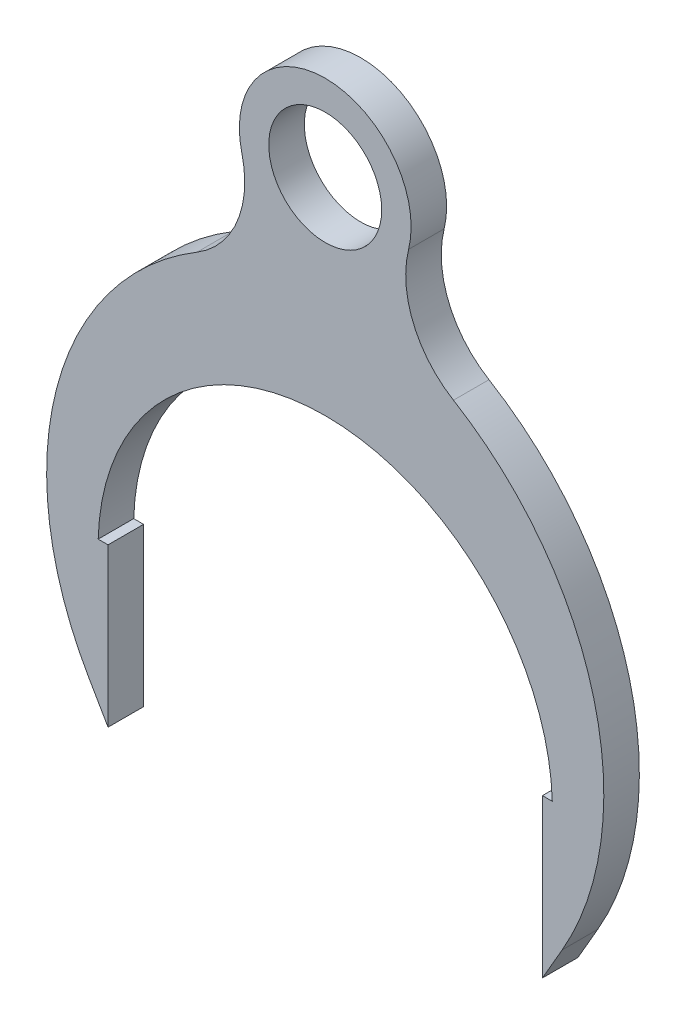
ISO-10303-21;
HEADER;
FILE_DESCRIPTION(('STEP AP214'),'2;1');
FILE_NAME('part.step','',(''),(''),'','','');
FILE_SCHEMA(('AUTOMOTIVE_DESIGN { 1 0 10303 214 1 1 1 1 }'));
ENDSEC;
DATA;
#1=APPLICATION_CONTEXT('core data for automotive mechanical design processes');
#2=APPLICATION_PROTOCOL_DEFINITION('international standard','automotive_design',2000,#1);
#3=PRODUCT_CONTEXT('',#1,'mechanical');
#4=PRODUCT('Part','Part','',(#3));
#5=PRODUCT_RELATED_PRODUCT_CATEGORY('part','',(#4));
#6=PRODUCT_DEFINITION_FORMATION('','',#4);
#7=PRODUCT_DEFINITION_CONTEXT('part definition',#1,'design');
#8=PRODUCT_DEFINITION('design','',#6,#7);
#9=PRODUCT_DEFINITION_SHAPE('','',#8);
#10=(LENGTH_UNIT() NAMED_UNIT(*) SI_UNIT(.MILLI.,.METRE.));
#11=(NAMED_UNIT(*) PLANE_ANGLE_UNIT() SI_UNIT($,.RADIAN.));
#12=(NAMED_UNIT(*) SI_UNIT($,.STERADIAN.) SOLID_ANGLE_UNIT());
#13=UNCERTAINTY_MEASURE_WITH_UNIT(LENGTH_MEASURE(1.E-05),#10,'distance_accuracy_value','');
#14=(GEOMETRIC_REPRESENTATION_CONTEXT(3) GLOBAL_UNCERTAINTY_ASSIGNED_CONTEXT((#13)) GLOBAL_UNIT_ASSIGNED_CONTEXT((#10,
#11,#12)) REPRESENTATION_CONTEXT('',''));
#15=CARTESIAN_POINT('',(0.,0.,0.));
#16=DIRECTION('',(0.,0.,1.));
#17=DIRECTION('',(1.,0.,0.));
#18=AXIS2_PLACEMENT_3D('',#15,#16,#17);
#19=CARTESIAN_POINT('',(-55.0000000000003,-148.087398310348,9.));
#20=DIRECTION('',(-0.866025403784441,-0.499999999999996,0.));
#21=DIRECTION('',(0.499999999999996,-0.866025403784441,0.));
#22=AXIS2_PLACEMENT_3D('',#19,#20,#21);
#23=PLANE('',#22);
#24=DIRECTION('',(0.,0.,1.));
#25=VECTOR('',#24,1.);
#26=CARTESIAN_POINT('',(-60.0000000000003,-139.427144272504,9.));
#27=LINE('',#26,#25);
#28=CARTESIAN_POINT('',(-60.0000000000003,-139.427144272504,0.));
#29=VERTEX_POINT('',#28);
#30=CARTESIAN_POINT('',(-60.0000000000003,-139.427144272504,9.));
#31=VERTEX_POINT('',#30);
#32=EDGE_CURVE('E11',#29,#31,#27,.T.);
#33=ORIENTED_EDGE('',*,*,#32,.F.);
#34=DIRECTION('',(0.499999999999996,-0.866025403784441,0.));
#35=VECTOR('',#34,1.);
#36=CARTESIAN_POINT('',(-55.0000000000003,-148.087398310348,0.));
#37=LINE('',#36,#35);
#38=CARTESIAN_POINT('',(-55.0000000000003,-148.087398310348,0.));
#39=VERTEX_POINT('',#38);
#40=EDGE_CURVE('E120',#29,#39,#37,.T.);
#41=ORIENTED_EDGE('',*,*,#40,.T.);
#42=DIRECTION('',(0.,0.,1.));
#43=VECTOR('',#42,1.);
#44=CARTESIAN_POINT('',(-55.0000000000003,-148.087398310348,9.));
#45=LINE('',#44,#43);
#46=CARTESIAN_POINT('',(-55.0000000000003,-148.087398310348,9.));
#47=VERTEX_POINT('',#46);
#48=EDGE_CURVE('E49',#39,#47,#45,.T.);
#49=ORIENTED_EDGE('',*,*,#48,.T.);
#50=DIRECTION('',(0.499999999999996,-0.866025403784441,0.));
#51=VECTOR('',#50,1.);
#52=CARTESIAN_POINT('',(-55.0000000000003,-148.087398310348,9.));
#53=LINE('',#52,#51);
#54=EDGE_CURVE('E186',#31,#47,#53,.T.);
#55=ORIENTED_EDGE('',*,*,#54,.F.);
#56=EDGE_LOOP('',(#33,#41,#49,#55));
#57=FACE_BOUND('',#56,.T.);
#58=ADVANCED_FACE('F39',(#57),#23,.T.);
#59=CARTESIAN_POINT('',(-55.0000000000003,-108.087398310348,9.));
#60=DIRECTION('',(1.,0.,0.));
#61=DIRECTION('',(0.,1.,0.));
#62=AXIS2_PLACEMENT_3D('',#59,#60,#61);
#63=PLANE('',#62);
#64=ORIENTED_EDGE('',*,*,#48,.F.);
#65=DIRECTION('',(0.,1.,0.));
#66=VECTOR('',#65,1.);
#67=CARTESIAN_POINT('',(-55.0000000000003,-11.2253442370643,0.));
#68=LINE('',#67,#66);
#69=CARTESIAN_POINT('',(-55.0000000000003,-108.087398310348,0.));
#70=VERTEX_POINT('',#69);
#71=EDGE_CURVE('E151',#39,#70,#68,.T.);
#72=ORIENTED_EDGE('',*,*,#71,.T.);
#73=DIRECTION('',(0.,0.,1.));
#74=VECTOR('',#73,1.);
#75=CARTESIAN_POINT('',(-55.0000000000003,-108.087398310348,9.));
#76=LINE('',#75,#74);
#77=CARTESIAN_POINT('',(-55.0000000000003,-108.087398310348,9.));
#78=VERTEX_POINT('',#77);
#79=EDGE_CURVE('E179',#70,#78,#76,.T.);
#80=ORIENTED_EDGE('',*,*,#79,.T.);
#81=DIRECTION('',(0.,1.,0.));
#82=VECTOR('',#81,1.);
#83=CARTESIAN_POINT('',(-55.0000000000003,-108.087398310348,9.));
#84=LINE('',#83,#82);
#85=EDGE_CURVE('E196',#47,#78,#84,.T.);
#86=ORIENTED_EDGE('',*,*,#85,.F.);
#87=EDGE_LOOP('',(#64,#72,#80,#86));
#88=FACE_BOUND('',#87,.T.);
#89=ADVANCED_FACE('F199',(#88),#63,.T.);
#90=CARTESIAN_POINT('',(-57.5000000000003,-108.087398310348,9.));
#91=DIRECTION('',(0.,1.,0.));
#92=DIRECTION('',(-1.,0.,0.));
#93=AXIS2_PLACEMENT_3D('',#90,#91,#92);
#94=PLANE('',#93);
#95=ORIENTED_EDGE('',*,*,#79,.F.);
#96=DIRECTION('',(1.,0.,0.));
#97=VECTOR('',#96,1.);
#98=CARTESIAN_POINT('',(-45.382310945559,-108.087398310348,0.));
#99=LINE('',#98,#97);
#100=CARTESIAN_POINT('',(-57.5000000000003,-108.087398310348,0.));
#101=VERTEX_POINT('',#100);
#102=EDGE_CURVE('E148',#70,#101,#99,.F.);
#103=ORIENTED_EDGE('',*,*,#102,.T.);
#104=DIRECTION('',(0.,0.,1.));
#105=VECTOR('',#104,1.);
#106=CARTESIAN_POINT('',(-57.5000000000003,-108.087398310348,9.));
#107=LINE('',#106,#105);
#108=CARTESIAN_POINT('',(-57.5000000000003,-108.087398310348,9.));
#109=VERTEX_POINT('',#108);
#110=EDGE_CURVE('E176',#101,#109,#107,.T.);
#111=ORIENTED_EDGE('',*,*,#110,.T.);
#112=DIRECTION('',(-1.,0.,0.));
#113=VECTOR('',#112,1.);
#114=CARTESIAN_POINT('',(-57.5000000000003,-108.087398310348,9.));
#115=LINE('',#114,#113);
#116=EDGE_CURVE('E200',#78,#109,#115,.T.);
#117=ORIENTED_EDGE('',*,*,#116,.F.);
#118=EDGE_LOOP('',(#95,#103,#111,#117));
#119=FACE_BOUND('',#118,.T.);
#120=ADVANCED_FACE('F240',(#119),#94,.T.);
#121=CARTESIAN_POINT('',(0.,-109.774752625142,9.));
#122=DIRECTION('',(0.,0.,1.));
#123=DIRECTION('',(1.,0.,0.));
#124=AXIS2_PLACEMENT_3D('',#121,#122,#123);
#125=CYLINDRICAL_SURFACE('',#124,57.5247526251412);
#126=ORIENTED_EDGE('',*,*,#110,.F.);
#127=CARTESIAN_POINT('',(0.,-109.774752625142,0.));
#128=DIRECTION('',(0.,0.,-1.));
#129=DIRECTION('',(-1.,0.,0.));
#130=AXIS2_PLACEMENT_3D('',#127,#128,#129);
#131=CIRCLE('',#130,57.5247526251412);
#132=CARTESIAN_POINT('',(57.5000000000003,-108.087398310348,0.));
#133=VERTEX_POINT('',#132);
#134=EDGE_CURVE('E145',#101,#133,#131,.T.);
#135=ORIENTED_EDGE('',*,*,#134,.T.);
#136=DIRECTION('',(0.,0.,1.));
#137=VECTOR('',#136,1.);
#138=CARTESIAN_POINT('',(57.5000000000003,-108.087398310348,9.));
#139=LINE('',#138,#137);
#140=CARTESIAN_POINT('',(57.5000000000003,-108.087398310348,9.));
#141=VERTEX_POINT('',#140);
#142=EDGE_CURVE('E173',#133,#141,#139,.T.);
#143=ORIENTED_EDGE('',*,*,#142,.T.);
#144=CARTESIAN_POINT('',(0.,-109.774752625142,9.));
#145=DIRECTION('',(0.,0.,-1.));
#146=DIRECTION('',(-1.,0.,0.));
#147=AXIS2_PLACEMENT_3D('',#144,#145,#146);
#148=CIRCLE('',#147,57.5247526251412);
#149=EDGE_CURVE('E202',#109,#141,#148,.T.);
#150=ORIENTED_EDGE('',*,*,#149,.F.);
#151=EDGE_LOOP('',(#126,#135,#143,#150));
#152=FACE_BOUND('',#151,.T.);
#153=ADVANCED_FACE('F273',(#152),#125,.F.);
#154=CARTESIAN_POINT('',(57.5000000000003,-108.087398310348,9.));
#155=DIRECTION('',(0.,1.,0.));
#156=DIRECTION('',(-1.,0.,0.));
#157=AXIS2_PLACEMENT_3D('',#154,#155,#156);
#158=PLANE('',#157);
#159=ORIENTED_EDGE('',*,*,#142,.F.);
#160=DIRECTION('',(1.,0.,0.));
#161=VECTOR('',#160,1.);
#162=CARTESIAN_POINT('',(-45.382310945559,-108.087398310348,0.));
#163=LINE('',#162,#161);
#164=CARTESIAN_POINT('',(55.0000000000003,-108.087398310348,0.));
#165=VERTEX_POINT('',#164);
#166=EDGE_CURVE('E142',#133,#165,#163,.F.);
#167=ORIENTED_EDGE('',*,*,#166,.T.);
#168=DIRECTION('',(0.,0.,1.));
#169=VECTOR('',#168,1.);
#170=CARTESIAN_POINT('',(55.0000000000003,-108.087398310348,9.));
#171=LINE('',#170,#169);
#172=CARTESIAN_POINT('',(55.0000000000003,-108.087398310348,9.));
#173=VERTEX_POINT('',#172);
#174=EDGE_CURVE('E170',#165,#173,#171,.T.);
#175=ORIENTED_EDGE('',*,*,#174,.T.);
#176=DIRECTION('',(-1.,0.,0.));
#177=VECTOR('',#176,1.);
#178=CARTESIAN_POINT('',(57.5000000000003,-108.087398310348,9.));
#179=LINE('',#178,#177);
#180=EDGE_CURVE('E208',#141,#173,#179,.T.);
#181=ORIENTED_EDGE('',*,*,#180,.F.);
#182=EDGE_LOOP('',(#159,#167,#175,#181));
#183=FACE_BOUND('',#182,.T.);
#184=ADVANCED_FACE('F269',(#183),#158,.T.);
#185=CARTESIAN_POINT('',(55.0000000000003,-108.087398310348,9.));
#186=DIRECTION('',(-1.,0.,0.));
#187=DIRECTION('',(0.,-1.,0.));
#188=AXIS2_PLACEMENT_3D('',#185,#186,#187);
#189=PLANE('',#188);
#190=ORIENTED_EDGE('',*,*,#174,.F.);
#191=DIRECTION('',(0.,1.,0.));
#192=VECTOR('',#191,1.);
#193=CARTESIAN_POINT('',(55.0000000000003,-11.2253442370643,0.));
#194=LINE('',#193,#192);
#195=CARTESIAN_POINT('',(55.0000000000003,-148.087398310348,0.));
#196=VERTEX_POINT('',#195);
#197=EDGE_CURVE('E139',#165,#196,#194,.F.);
#198=ORIENTED_EDGE('',*,*,#197,.T.);
#199=DIRECTION('',(0.,0.,1.));
#200=VECTOR('',#199,1.);
#201=CARTESIAN_POINT('',(55.0000000000003,-148.087398310348,9.));
#202=LINE('',#201,#200);
#203=CARTESIAN_POINT('',(55.0000000000003,-148.087398310348,9.));
#204=VERTEX_POINT('',#203);
#205=EDGE_CURVE('E167',#196,#204,#202,.T.);
#206=ORIENTED_EDGE('',*,*,#205,.T.);
#207=DIRECTION('',(0.,-1.,0.));
#208=VECTOR('',#207,1.);
#209=CARTESIAN_POINT('',(55.0000000000003,-108.087398310348,9.));
#210=LINE('',#209,#208);
#211=EDGE_CURVE('E211',#173,#204,#210,.T.);
#212=ORIENTED_EDGE('',*,*,#211,.F.);
#213=EDGE_LOOP('',(#190,#198,#206,#212));
#214=FACE_BOUND('',#213,.T.);
#215=ADVANCED_FACE('F265',(#214),#189,.T.);
#216=CARTESIAN_POINT('',(55.0000000000003,-148.087398310348,9.));
#217=DIRECTION('',(0.866025403784441,-0.499999999999996,0.));
#218=DIRECTION('',(0.499999999999996,0.866025403784441,0.));
#219=AXIS2_PLACEMENT_3D('',#216,#217,#218);
#220=PLANE('',#219);
#221=ORIENTED_EDGE('',*,*,#205,.F.);
#222=DIRECTION('',(0.499999999999996,0.866025403784441,0.));
#223=VECTOR('',#222,1.);
#224=CARTESIAN_POINT('',(55.0000000000003,-148.087398310348,0.));
#225=LINE('',#224,#223);
#226=CARTESIAN_POINT('',(60.0000000000003,-139.427144272504,0.));
#227=VERTEX_POINT('',#226);
#228=EDGE_CURVE('E136',#196,#227,#225,.T.);
#229=ORIENTED_EDGE('',*,*,#228,.T.);
#230=DIRECTION('',(0.,0.,1.));
#231=VECTOR('',#230,1.);
#232=CARTESIAN_POINT('',(60.0000000000003,-139.427144272504,9.));
#233=LINE('',#232,#231);
#234=CARTESIAN_POINT('',(60.0000000000003,-139.427144272504,9.));
#235=VERTEX_POINT('',#234);
#236=EDGE_CURVE('E164',#227,#235,#233,.T.);
#237=ORIENTED_EDGE('',*,*,#236,.T.);
#238=DIRECTION('',(0.499999999999996,0.866025403784441,0.));
#239=VECTOR('',#238,1.);
#240=CARTESIAN_POINT('',(55.0000000000003,-148.087398310348,9.));
#241=LINE('',#240,#239);
#242=EDGE_CURVE('E214',#204,#235,#241,.T.);
#243=ORIENTED_EDGE('',*,*,#242,.F.);
#244=EDGE_LOOP('',(#221,#229,#237,#243));
#245=FACE_BOUND('',#244,.T.);
#246=ADVANCED_FACE('F261',(#245),#220,.T.);
#247=CARTESIAN_POINT('',(-8.18736645978353,-100.059149891616,9.));
#248=DIRECTION('',(0.,0.,1.));
#249=DIRECTION('',(1.,0.,0.));
#250=AXIS2_PLACEMENT_3D('',#247,#248,#249);
#251=CYLINDRICAL_SURFACE('',#250,78.7359887617754);
#252=ORIENTED_EDGE('',*,*,#236,.F.);
#253=CARTESIAN_POINT('',(-8.18736645978353,-100.059149891616,0.));
#254=DIRECTION('',(0.,0.,1.));
#255=DIRECTION('',(1.,0.,0.));
#256=AXIS2_PLACEMENT_3D('',#253,#254,#255);
#257=CIRCLE('',#256,78.7359887617754);
#258=CARTESIAN_POINT('',(32.4722114601329,-32.6339717333892,0.));
#259=VERTEX_POINT('',#258);
#260=EDGE_CURVE('E133',#227,#259,#257,.T.);
#261=ORIENTED_EDGE('',*,*,#260,.T.);
#262=DIRECTION('',(0.,0.,1.));
#263=VECTOR('',#262,1.);
#264=CARTESIAN_POINT('',(32.4722114601329,-32.6339717333892,9.));
#265=LINE('',#264,#263);
#266=CARTESIAN_POINT('',(32.4722114601329,-32.6339717333892,9.));
#267=VERTEX_POINT('',#266);
#268=EDGE_CURVE('E161',#259,#267,#265,.T.);
#269=ORIENTED_EDGE('',*,*,#268,.T.);
#270=CARTESIAN_POINT('',(-8.18736645978353,-100.059149891616,9.));
#271=DIRECTION('',(0.,0.,1.));
#272=DIRECTION('',(1.,0.,0.));
#273=AXIS2_PLACEMENT_3D('',#270,#271,#272);
#274=CIRCLE('',#273,78.7359887617754);
#275=EDGE_CURVE('E217',#235,#267,#274,.T.);
#276=ORIENTED_EDGE('',*,*,#275,.F.);
#277=EDGE_LOOP('',(#252,#261,#269,#276));
#278=FACE_BOUND('',#277,.T.);
#279=ADVANCED_FACE('F257',(#278),#251,.T.);
#280=CARTESIAN_POINT('',(45.382310945559,-11.2253442370643,9.));
#281=DIRECTION('',(0.,0.,1.));
#282=DIRECTION('',(1.,0.,0.));
#283=AXIS2_PLACEMENT_3D('',#280,#281,#282);
#284=CYLINDRICAL_SURFACE('',#283,25.);
#285=ORIENTED_EDGE('',*,*,#268,.F.);
#286=CARTESIAN_POINT('',(45.382310945559,-11.2253442370643,0.));
#287=DIRECTION('',(0.,0.,-1.));
#288=DIRECTION('',(-1.,0.,0.));
#289=AXIS2_PLACEMENT_3D('',#286,#287,#288);
#290=CIRCLE('',#289,25.);
#291=CARTESIAN_POINT('',(21.1136954666505,-5.22248635628125,0.));
#292=VERTEX_POINT('',#291);
#293=EDGE_CURVE('E130',#259,#292,#290,.T.);
#294=ORIENTED_EDGE('',*,*,#293,.T.);
#295=DIRECTION('',(0.,0.,1.));
#296=VECTOR('',#295,1.);
#297=CARTESIAN_POINT('',(21.1136954666505,-5.22248635628125,9.));
#298=LINE('',#297,#296);
#299=CARTESIAN_POINT('',(21.1136954666505,-5.22248635628125,9.));
#300=VERTEX_POINT('',#299);
#301=EDGE_CURVE('E159',#292,#300,#298,.T.);
#302=ORIENTED_EDGE('',*,*,#301,.T.);
#303=CARTESIAN_POINT('',(45.382310945559,-11.2253442370643,9.));
#304=DIRECTION('',(0.,0.,-1.));
#305=DIRECTION('',(-1.,0.,0.));
#306=AXIS2_PLACEMENT_3D('',#303,#304,#305);
#307=CIRCLE('',#306,25.);
#308=EDGE_CURVE('E220',#267,#300,#307,.T.);
#309=ORIENTED_EDGE('',*,*,#308,.F.);
#310=EDGE_LOOP('',(#285,#294,#302,#309));
#311=FACE_BOUND('',#310,.T.);
#312=ADVANCED_FACE('F252',(#311),#284,.F.);
#313=CARTESIAN_POINT('',(0.,0.,9.));
#314=DIRECTION('',(0.,0.,1.));
#315=DIRECTION('',(1.,0.,0.));
#316=AXIS2_PLACEMENT_3D('',#313,#314,#315);
#317=CYLINDRICAL_SURFACE('',#316,21.75);
#318=ORIENTED_EDGE('',*,*,#301,.F.);
#319=CARTESIAN_POINT('',(0.,0.,0.));
#320=DIRECTION('',(0.,0.,1.));
#321=DIRECTION('',(1.,0.,0.));
#322=AXIS2_PLACEMENT_3D('',#319,#320,#321);
#323=CIRCLE('',#322,21.75);
#324=CARTESIAN_POINT('',(-21.1136954666504,-5.22248635628127,0.));
#325=VERTEX_POINT('',#324);
#326=EDGE_CURVE('E127',#292,#325,#323,.T.);
#327=ORIENTED_EDGE('',*,*,#326,.T.);
#328=DIRECTION('',(0.,0.,1.));
#329=VECTOR('',#328,1.);
#330=CARTESIAN_POINT('',(-21.1136954666504,-5.22248635628127,9.));
#331=LINE('',#330,#329);
#332=CARTESIAN_POINT('',(-21.1136954666504,-5.22248635628127,9.));
#333=VERTEX_POINT('',#332);
#334=EDGE_CURVE('E57',#325,#333,#331,.T.);
#335=ORIENTED_EDGE('',*,*,#334,.T.);
#336=CARTESIAN_POINT('',(0.,0.,9.));
#337=DIRECTION('',(0.,0.,1.));
#338=DIRECTION('',(1.,0.,0.));
#339=AXIS2_PLACEMENT_3D('',#336,#337,#338);
#340=CIRCLE('',#339,21.75);
#341=EDGE_CURVE('E222',#300,#333,#340,.T.);
#342=ORIENTED_EDGE('',*,*,#341,.F.);
#343=EDGE_LOOP('',(#318,#327,#335,#342));
#344=FACE_BOUND('',#343,.T.);
#345=ADVANCED_FACE('F247',(#344),#317,.T.);
#346=CARTESIAN_POINT('',(-45.382310945559,-11.2253442370643,9.));
#347=DIRECTION('',(0.,0.,1.));
#348=DIRECTION('',(1.,0.,0.));
#349=AXIS2_PLACEMENT_3D('',#346,#347,#348);
#350=CYLINDRICAL_SURFACE('',#349,25.);
#351=ORIENTED_EDGE('',*,*,#334,.F.);
#352=CARTESIAN_POINT('',(-45.382310945559,-11.2253442370643,0.));
#353=DIRECTION('',(0.,0.,-1.));
#354=DIRECTION('',(-1.,0.,0.));
#355=AXIS2_PLACEMENT_3D('',#352,#353,#354);
#356=CIRCLE('',#355,25.);
#357=CARTESIAN_POINT('',(-32.4722114601329,-32.6339717333892,0.));
#358=VERTEX_POINT('',#357);
#359=EDGE_CURVE('E118',#325,#358,#356,.T.);
#360=ORIENTED_EDGE('',*,*,#359,.T.);
#361=DIRECTION('',(0.,0.,1.));
#362=VECTOR('',#361,1.);
#363=CARTESIAN_POINT('',(-32.4722114601329,-32.6339717333892,9.));
#364=LINE('',#363,#362);
#365=CARTESIAN_POINT('',(-32.4722114601329,-32.6339717333892,9.));
#366=VERTEX_POINT('',#365);
#367=EDGE_CURVE('E43',#358,#366,#364,.T.);
#368=ORIENTED_EDGE('',*,*,#367,.T.);
#369=CARTESIAN_POINT('',(-45.382310945559,-11.2253442370643,9.));
#370=DIRECTION('',(0.,0.,-1.));
#371=DIRECTION('',(1.,0.,0.));
#372=AXIS2_PLACEMENT_3D('',#369,#370,#371);
#373=CIRCLE('',#372,25.);
#374=EDGE_CURVE('E157',#333,#366,#373,.T.);
#375=ORIENTED_EDGE('',*,*,#374,.F.);
#376=EDGE_LOOP('',(#351,#360,#368,#375));
#377=FACE_BOUND('',#376,.T.);
#378=ADVANCED_FACE('F122',(#377),#350,.F.);
#379=CARTESIAN_POINT('',(8.18736645978353,-100.059149891616,9.));
#380=DIRECTION('',(0.,0.,1.));
#381=DIRECTION('',(1.,0.,0.));
#382=AXIS2_PLACEMENT_3D('',#379,#380,#381);
#383=CYLINDRICAL_SURFACE('',#382,78.7359887617754);
#384=CARTESIAN_POINT('',(8.18736645978353,-100.059149891616,0.));
#385=DIRECTION('',(0.,0.,1.));
#386=DIRECTION('',(1.,0.,0.));
#387=AXIS2_PLACEMENT_3D('',#384,#385,#386);
#388=CIRCLE('',#387,78.7359887617754);
#389=EDGE_CURVE('E106',#358,#29,#388,.T.);
#390=ORIENTED_EDGE('',*,*,#389,.T.);
#391=ORIENTED_EDGE('',*,*,#32,.T.);
#392=CARTESIAN_POINT('',(8.18736645978353,-100.059149891616,9.));
#393=DIRECTION('',(0.,0.,1.));
#394=DIRECTION('',(-1.,0.,0.));
#395=AXIS2_PLACEMENT_3D('',#392,#393,#394);
#396=CIRCLE('',#395,78.7359887617754);
#397=EDGE_CURVE('E108',#366,#31,#396,.T.);
#398=ORIENTED_EDGE('',*,*,#397,.F.);
#399=ORIENTED_EDGE('',*,*,#367,.F.);
#400=EDGE_LOOP('',(#390,#391,#398,#399));
#401=FACE_BOUND('',#400,.T.);
#402=ADVANCED_FACE('F105',(#401),#383,.T.);
#403=CARTESIAN_POINT('',(0.,0.,9.));
#404=DIRECTION('',(0.,0.,1.));
#405=DIRECTION('',(1.,0.,0.));
#406=AXIS2_PLACEMENT_3D('',#403,#404,#405);
#407=CYLINDRICAL_SURFACE('',#406,14.3);
#408=CARTESIAN_POINT('',(0.,0.,9.));
#409=DIRECTION('',(0.,0.,1.));
#410=DIRECTION('',(1.,0.,0.));
#411=AXIS2_PLACEMENT_3D('',#408,#409,#410);
#412=CIRCLE('',#411,14.3);
#413=CARTESIAN_POINT('',(14.3,0.,9.));
#414=VERTEX_POINT('',#413);
#415=EDGE_CURVE('E112',#414,#414,#412,.T.);
#416=ORIENTED_EDGE('',*,*,#415,.T.);
#417=EDGE_LOOP('',(#416));
#418=FACE_BOUND('',#417,.T.);
#419=CARTESIAN_POINT('',(0.,0.,0.));
#420=DIRECTION('',(0.,0.,1.));
#421=DIRECTION('',(1.,0.,0.));
#422=AXIS2_PLACEMENT_3D('',#419,#420,#421);
#423=CIRCLE('',#422,14.3);
#424=CARTESIAN_POINT('',(14.3,0.,0.));
#425=VERTEX_POINT('',#424);
#426=EDGE_CURVE('E129',#425,#425,#423,.T.);
#427=ORIENTED_EDGE('',*,*,#426,.F.);
#428=EDGE_LOOP('',(#427));
#429=FACE_BOUND('',#428,.T.);
#430=ADVANCED_FACE('F41',(#418,#429),#407,.F.);
#431=CARTESIAN_POINT('',(-45.382310945559,-11.2253442370643,9.));
#432=DIRECTION('',(0.,0.,1.));
#433=DIRECTION('',(1.,0.,0.));
#434=AXIS2_PLACEMENT_3D('',#431,#432,#433);
#435=PLANE('',#434);
#436=ORIENTED_EDGE('',*,*,#374,.T.);
#437=ORIENTED_EDGE('',*,*,#397,.T.);
#438=ORIENTED_EDGE('',*,*,#54,.T.);
#439=ORIENTED_EDGE('',*,*,#85,.T.);
#440=ORIENTED_EDGE('',*,*,#116,.T.);
#441=ORIENTED_EDGE('',*,*,#149,.T.);
#442=ORIENTED_EDGE('',*,*,#180,.T.);
#443=ORIENTED_EDGE('',*,*,#211,.T.);
#444=ORIENTED_EDGE('',*,*,#242,.T.);
#445=ORIENTED_EDGE('',*,*,#275,.T.);
#446=ORIENTED_EDGE('',*,*,#308,.T.);
#447=ORIENTED_EDGE('',*,*,#341,.T.);
#448=EDGE_LOOP('',(#436,#437,#438,#439,#440,#441,#442,#443,#444,#445,#446,#447));
#449=FACE_BOUND('',#448,.T.);
#450=ORIENTED_EDGE('',*,*,#415,.F.);
#451=EDGE_LOOP('',(#450));
#452=FACE_BOUND('',#451,.T.);
#453=ADVANCED_FACE('F193',(#449,#452),#435,.T.);
#454=CARTESIAN_POINT('',(-45.382310945559,-11.2253442370643,0.));
#455=DIRECTION('',(0.,0.,1.));
#456=DIRECTION('',(1.,0.,0.));
#457=AXIS2_PLACEMENT_3D('',#454,#455,#456);
#458=PLANE('',#457);
#459=ORIENTED_EDGE('',*,*,#359,.F.);
#460=ORIENTED_EDGE('',*,*,#326,.F.);
#461=ORIENTED_EDGE('',*,*,#293,.F.);
#462=ORIENTED_EDGE('',*,*,#260,.F.);
#463=ORIENTED_EDGE('',*,*,#228,.F.);
#464=ORIENTED_EDGE('',*,*,#197,.F.);
#465=ORIENTED_EDGE('',*,*,#166,.F.);
#466=ORIENTED_EDGE('',*,*,#134,.F.);
#467=ORIENTED_EDGE('',*,*,#102,.F.);
#468=ORIENTED_EDGE('',*,*,#71,.F.);
#469=ORIENTED_EDGE('',*,*,#40,.F.);
#470=ORIENTED_EDGE('',*,*,#389,.F.);
#471=EDGE_LOOP('',(#459,#460,#461,#462,#463,#464,#465,#466,#467,#468,#469,#470));
#472=FACE_BOUND('',#471,.T.);
#473=ORIENTED_EDGE('',*,*,#426,.T.);
#474=EDGE_LOOP('',(#473));
#475=FACE_BOUND('',#474,.T.);
#476=ADVANCED_FACE('F115',(#472,#475),#458,.F.);
#477=CLOSED_SHELL('',(#58,#89,#120,#153,#184,#215,#246,#279,#312,#345,#378,#402,#430,#453,#476));
#478=MANIFOLD_SOLID_BREP('B2',#477);
#479=ADVANCED_BREP_SHAPE_REPRESENTATION('',(#18,#478),#14);
#480=SHAPE_DEFINITION_REPRESENTATION(#9,#479);
ENDSEC;
END-ISO-10303-21;
